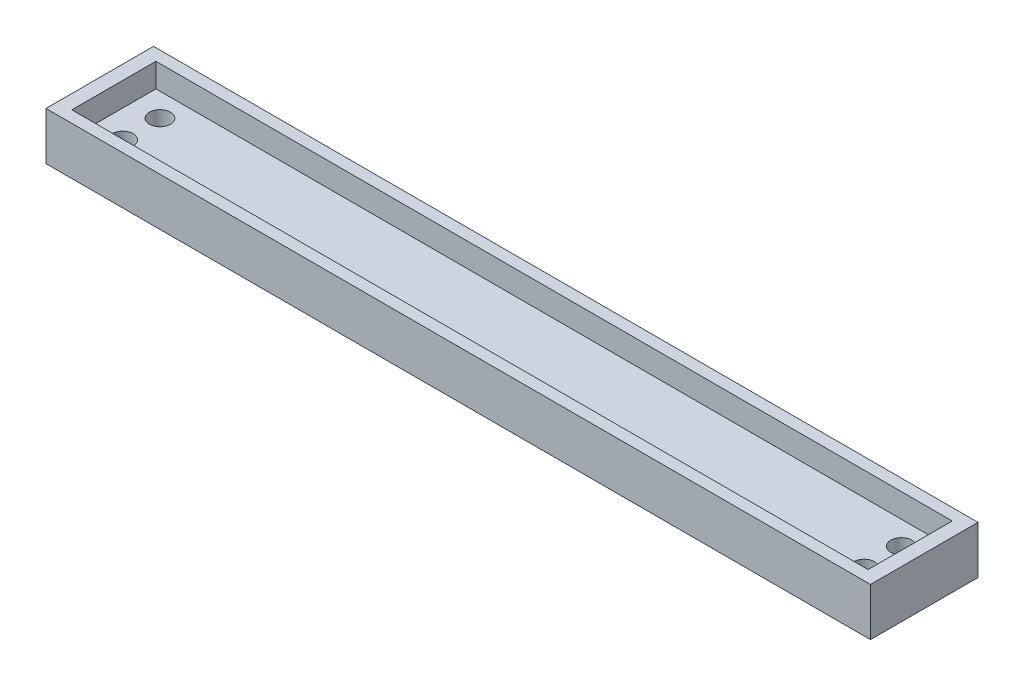
ISO-10303-21;
HEADER;
FILE_DESCRIPTION(('STEP AP214'),'2;1');
FILE_NAME('part.step','',(''),(''),'','','');
FILE_SCHEMA(('AUTOMOTIVE_DESIGN { 1 0 10303 214 1 1 1 1 }'));
ENDSEC;
DATA;
#1=APPLICATION_CONTEXT('core data for automotive mechanical design processes');
#2=APPLICATION_PROTOCOL_DEFINITION('international standard','automotive_design',2000,#1);
#3=PRODUCT_CONTEXT('',#1,'mechanical');
#4=PRODUCT('Part','Part','',(#3));
#5=PRODUCT_RELATED_PRODUCT_CATEGORY('part','',(#4));
#6=PRODUCT_DEFINITION_FORMATION('','',#4);
#7=PRODUCT_DEFINITION_CONTEXT('part definition',#1,'design');
#8=PRODUCT_DEFINITION('design','',#6,#7);
#9=PRODUCT_DEFINITION_SHAPE('','',#8);
#10=(LENGTH_UNIT() NAMED_UNIT(*) SI_UNIT(.MILLI.,.METRE.));
#11=(NAMED_UNIT(*) PLANE_ANGLE_UNIT() SI_UNIT($,.RADIAN.));
#12=(NAMED_UNIT(*) SI_UNIT($,.STERADIAN.) SOLID_ANGLE_UNIT());
#13=UNCERTAINTY_MEASURE_WITH_UNIT(LENGTH_MEASURE(1.E-05),#10,'distance_accuracy_value','');
#14=(GEOMETRIC_REPRESENTATION_CONTEXT(3) GLOBAL_UNCERTAINTY_ASSIGNED_CONTEXT((#13)) GLOBAL_UNIT_ASSIGNED_CONTEXT((#10,
#11,#12)) REPRESENTATION_CONTEXT('',''));
#15=CARTESIAN_POINT('',(0.,0.,0.));
#16=DIRECTION('',(0.,0.,1.));
#17=DIRECTION('',(1.,0.,0.));
#18=AXIS2_PLACEMENT_3D('',#15,#16,#17);
#19=CARTESIAN_POINT('',(0.,12.7,0.));
#20=DIRECTION('',(1.,0.,0.));
#21=DIRECTION('',(0.,0.,-1.));
#22=AXIS2_PLACEMENT_3D('',#19,#20,#21);
#23=PLANE('',#22);
#24=DIRECTION('',(0.,0.,1.));
#25=VECTOR('',#24,1.);
#26=CARTESIAN_POINT('',(0.,0.,0.));
#27=LINE('',#26,#25);
#28=CARTESIAN_POINT('',(0.,0.,-28.575));
#29=VERTEX_POINT('',#28);
#30=CARTESIAN_POINT('',(0.,0.,0.));
#31=VERTEX_POINT('',#30);
#32=EDGE_CURVE('E149',#29,#31,#27,.T.);
#33=ORIENTED_EDGE('',*,*,#32,.T.);
#34=DIRECTION('',(0.,-1.,0.));
#35=VECTOR('',#34,1.);
#36=CARTESIAN_POINT('',(0.,12.7,0.));
#37=LINE('',#36,#35);
#38=CARTESIAN_POINT('',(0.,12.7,0.));
#39=VERTEX_POINT('',#38);
#40=EDGE_CURVE('E11',#39,#31,#37,.T.);
#41=ORIENTED_EDGE('',*,*,#40,.F.);
#42=DIRECTION('',(0.,0.,1.));
#43=VECTOR('',#42,1.);
#44=CARTESIAN_POINT('',(0.,12.7,0.));
#45=LINE('',#44,#43);
#46=CARTESIAN_POINT('',(0.,12.7,-28.575));
#47=VERTEX_POINT('',#46);
#48=EDGE_CURVE('E153',#47,#39,#45,.T.);
#49=ORIENTED_EDGE('',*,*,#48,.F.);
#50=DIRECTION('',(0.,-1.,0.));
#51=VECTOR('',#50,1.);
#52=CARTESIAN_POINT('',(0.,12.7,-28.575));
#53=LINE('',#52,#51);
#54=EDGE_CURVE('E159',#47,#29,#53,.T.);
#55=ORIENTED_EDGE('',*,*,#54,.T.);
#56=EDGE_LOOP('',(#33,#41,#49,#55));
#57=FACE_BOUND('',#56,.T.);
#58=ADVANCED_FACE('F37',(#57),#23,.F.);
#59=CARTESIAN_POINT('',(0.,12.7,0.));
#60=DIRECTION('',(0.,0.,-1.));
#61=DIRECTION('',(-1.,0.,0.));
#62=AXIS2_PLACEMENT_3D('',#59,#60,#61);
#63=PLANE('',#62);
#64=DIRECTION('',(1.,0.,0.));
#65=VECTOR('',#64,1.);
#66=CARTESIAN_POINT('',(0.,0.,0.));
#67=LINE('',#66,#65);
#68=CARTESIAN_POINT('',(219.075,0.,0.));
#69=VERTEX_POINT('',#68);
#70=EDGE_CURVE('E162',#31,#69,#67,.T.);
#71=ORIENTED_EDGE('',*,*,#70,.T.);
#72=DIRECTION('',(0.,-1.,0.));
#73=VECTOR('',#72,1.);
#74=CARTESIAN_POINT('',(219.075,12.7,0.));
#75=LINE('',#74,#73);
#76=CARTESIAN_POINT('',(219.075,12.7,0.));
#77=VERTEX_POINT('',#76);
#78=EDGE_CURVE('E44',#77,#69,#75,.T.);
#79=ORIENTED_EDGE('',*,*,#78,.F.);
#80=DIRECTION('',(1.,0.,0.));
#81=VECTOR('',#80,1.);
#82=CARTESIAN_POINT('',(0.,12.7,0.));
#83=LINE('',#82,#81);
#84=EDGE_CURVE('E88',#39,#77,#83,.T.);
#85=ORIENTED_EDGE('',*,*,#84,.F.);
#86=ORIENTED_EDGE('',*,*,#40,.T.);
#87=EDGE_LOOP('',(#71,#79,#85,#86));
#88=FACE_BOUND('',#87,.T.);
#89=ADVANCED_FACE('F191',(#88),#63,.F.);
#90=CARTESIAN_POINT('',(219.075,12.7,0.));
#91=DIRECTION('',(-1.,0.,0.));
#92=DIRECTION('',(0.,0.,1.));
#93=AXIS2_PLACEMENT_3D('',#90,#91,#92);
#94=PLANE('',#93);
#95=DIRECTION('',(0.,0.,-1.));
#96=VECTOR('',#95,1.);
#97=CARTESIAN_POINT('',(219.075,0.,0.));
#98=LINE('',#97,#96);
#99=CARTESIAN_POINT('',(219.075,0.,-28.575));
#100=VERTEX_POINT('',#99);
#101=EDGE_CURVE('E164',#69,#100,#98,.T.);
#102=ORIENTED_EDGE('',*,*,#101,.T.);
#103=DIRECTION('',(0.,-1.,0.));
#104=VECTOR('',#103,1.);
#105=CARTESIAN_POINT('',(219.075,12.7,-28.575));
#106=LINE('',#105,#104);
#107=CARTESIAN_POINT('',(219.075,12.7,-28.575));
#108=VERTEX_POINT('',#107);
#109=EDGE_CURVE('E168',#108,#100,#106,.T.);
#110=ORIENTED_EDGE('',*,*,#109,.F.);
#111=DIRECTION('',(0.,0.,-1.));
#112=VECTOR('',#111,1.);
#113=CARTESIAN_POINT('',(219.075,12.7,0.));
#114=LINE('',#113,#112);
#115=EDGE_CURVE('E156',#77,#108,#114,.T.);
#116=ORIENTED_EDGE('',*,*,#115,.F.);
#117=ORIENTED_EDGE('',*,*,#78,.T.);
#118=EDGE_LOOP('',(#102,#110,#116,#117));
#119=FACE_BOUND('',#118,.T.);
#120=ADVANCED_FACE('F173',(#119),#94,.F.);
#121=CARTESIAN_POINT('',(0.,12.7,-28.575));
#122=DIRECTION('',(0.,0.,1.));
#123=DIRECTION('',(1.,0.,0.));
#124=AXIS2_PLACEMENT_3D('',#121,#122,#123);
#125=PLANE('',#124);
#126=DIRECTION('',(-1.,0.,0.));
#127=VECTOR('',#126,1.);
#128=CARTESIAN_POINT('',(0.,0.,-28.575));
#129=LINE('',#128,#127);
#130=EDGE_CURVE('E81',#100,#29,#129,.T.);
#131=ORIENTED_EDGE('',*,*,#130,.T.);
#132=ORIENTED_EDGE('',*,*,#54,.F.);
#133=DIRECTION('',(-1.,0.,0.));
#134=VECTOR('',#133,1.);
#135=CARTESIAN_POINT('',(0.,12.7,-28.575));
#136=LINE('',#135,#134);
#137=EDGE_CURVE('E60',#108,#47,#136,.T.);
#138=ORIENTED_EDGE('',*,*,#137,.F.);
#139=ORIENTED_EDGE('',*,*,#109,.T.);
#140=EDGE_LOOP('',(#131,#132,#138,#139));
#141=FACE_BOUND('',#140,.T.);
#142=ADVANCED_FACE('F181',(#141),#125,.F.);
#143=CARTESIAN_POINT('',(0.,12.7,0.));
#144=DIRECTION('',(0.,-1.,0.));
#145=DIRECTION('',(0.,0.,-1.));
#146=AXIS2_PLACEMENT_3D('',#143,#144,#145);
#147=PLANE('',#146);
#148=DIRECTION('',(1.,0.,0.));
#149=VECTOR('',#148,1.);
#150=CARTESIAN_POINT('',(3.74650000000001,12.7,-3.11149999999999));
#151=LINE('',#150,#149);
#152=CARTESIAN_POINT('',(3.74650000000001,12.7,-3.11149999999999));
#153=VERTEX_POINT('',#152);
#154=CARTESIAN_POINT('',(215.3285,12.7,-3.11150000000001));
#155=VERTEX_POINT('',#154);
#156=EDGE_CURVE('E142',#153,#155,#151,.T.);
#157=ORIENTED_EDGE('',*,*,#156,.F.);
#158=DIRECTION('',(0.,0.,1.));
#159=VECTOR('',#158,1.);
#160=CARTESIAN_POINT('',(3.74649999999999,12.7,-25.4635));
#161=LINE('',#160,#159);
#162=CARTESIAN_POINT('',(3.74649999999999,12.7,-25.4635));
#163=VERTEX_POINT('',#162);
#164=EDGE_CURVE('E51',#163,#153,#161,.T.);
#165=ORIENTED_EDGE('',*,*,#164,.F.);
#166=DIRECTION('',(-1.,0.,0.));
#167=VECTOR('',#166,1.);
#168=CARTESIAN_POINT('',(3.74649999999999,12.7,-25.4635));
#169=LINE('',#168,#167);
#170=CARTESIAN_POINT('',(215.3285,12.7,-25.4635));
#171=VERTEX_POINT('',#170);
#172=EDGE_CURVE('E130',#171,#163,#169,.T.);
#173=ORIENTED_EDGE('',*,*,#172,.F.);
#174=DIRECTION('',(0.,0.,-1.));
#175=VECTOR('',#174,1.);
#176=CARTESIAN_POINT('',(215.3285,12.7,-25.4635));
#177=LINE('',#176,#175);
#178=EDGE_CURVE('E133',#155,#171,#177,.T.);
#179=ORIENTED_EDGE('',*,*,#178,.F.);
#180=EDGE_LOOP('',(#157,#165,#173,#179));
#181=FACE_BOUND('',#180,.T.);
#182=ORIENTED_EDGE('',*,*,#48,.T.);
#183=ORIENTED_EDGE('',*,*,#84,.T.);
#184=ORIENTED_EDGE('',*,*,#115,.T.);
#185=ORIENTED_EDGE('',*,*,#137,.T.);
#186=EDGE_LOOP('',(#182,#183,#184,#185));
#187=FACE_BOUND('',#186,.T.);
#188=ADVANCED_FACE('F183',(#181,#187),#147,.F.);
#189=CARTESIAN_POINT('',(0.,0.,0.));
#190=DIRECTION('',(0.,-1.,0.));
#191=DIRECTION('',(0.,0.,-1.));
#192=AXIS2_PLACEMENT_3D('',#189,#190,#191);
#193=PLANE('',#192);
#194=CARTESIAN_POINT('',(208.0387,0.,-19.2405));
#195=DIRECTION('',(0.,1.,0.));
#196=DIRECTION('',(0.,0.,-1.));
#197=AXIS2_PLACEMENT_3D('',#194,#195,#196);
#198=CIRCLE('',#197,2.79399999999998);
#199=CARTESIAN_POINT('',(208.0387,0.,-22.0345));
#200=VERTEX_POINT('',#199);
#201=EDGE_CURVE('E314',#200,#200,#198,.T.);
#202=ORIENTED_EDGE('',*,*,#201,.T.);
#203=EDGE_LOOP('',(#202));
#204=FACE_BOUND('',#203,.T.);
#205=CARTESIAN_POINT('',(208.0387,0.,-9.33450000000004));
#206=DIRECTION('',(0.,1.,0.));
#207=DIRECTION('',(0.,0.,1.));
#208=AXIS2_PLACEMENT_3D('',#205,#206,#207);
#209=CIRCLE('',#208,2.79400000000001);
#210=CARTESIAN_POINT('',(208.0387,0.,-6.54050000000003));
#211=VERTEX_POINT('',#210);
#212=EDGE_CURVE('E335',#211,#211,#209,.T.);
#213=ORIENTED_EDGE('',*,*,#212,.T.);
#214=EDGE_LOOP('',(#213));
#215=FACE_BOUND('',#214,.T.);
#216=CARTESIAN_POINT('',(11.0363,0.,-9.33450000000002));
#217=DIRECTION('',(0.,1.,0.));
#218=DIRECTION('',(0.,0.,-1.));
#219=AXIS2_PLACEMENT_3D('',#216,#217,#218);
#220=CIRCLE('',#219,2.794);
#221=CARTESIAN_POINT('',(11.0363,0.,-12.1285));
#222=VERTEX_POINT('',#221);
#223=EDGE_CURVE('E326',#222,#222,#220,.T.);
#224=ORIENTED_EDGE('',*,*,#223,.T.);
#225=EDGE_LOOP('',(#224));
#226=FACE_BOUND('',#225,.T.);
#227=CARTESIAN_POINT('',(11.0363,0.,-19.2405));
#228=DIRECTION('',(0.,1.,0.));
#229=DIRECTION('',(0.,0.,1.));
#230=AXIS2_PLACEMENT_3D('',#227,#228,#229);
#231=CIRCLE('',#230,2.794);
#232=CARTESIAN_POINT('',(11.0363,0.,-16.4465));
#233=VERTEX_POINT('',#232);
#234=EDGE_CURVE('E143',#233,#233,#231,.T.);
#235=ORIENTED_EDGE('',*,*,#234,.T.);
#236=EDGE_LOOP('',(#235));
#237=FACE_BOUND('',#236,.T.);
#238=ORIENTED_EDGE('',*,*,#32,.F.);
#239=ORIENTED_EDGE('',*,*,#130,.F.);
#240=ORIENTED_EDGE('',*,*,#101,.F.);
#241=ORIENTED_EDGE('',*,*,#70,.F.);
#242=EDGE_LOOP('',(#238,#239,#240,#241));
#243=FACE_BOUND('',#242,.T.);
#244=ADVANCED_FACE('F177',(#204,#215,#226,#237,#243),#193,.T.);
#245=CARTESIAN_POINT('',(3.74649999999999,6.35,-25.4635));
#246=DIRECTION('',(-1.,0.,0.));
#247=DIRECTION('',(0.,0.,1.));
#248=AXIS2_PLACEMENT_3D('',#245,#246,#247);
#249=PLANE('',#248);
#250=ORIENTED_EDGE('',*,*,#164,.T.);
#251=DIRECTION('',(0.,1.,0.));
#252=VECTOR('',#251,1.);
#253=CARTESIAN_POINT('',(3.74650000000001,6.35,-3.11149999999999));
#254=LINE('',#253,#252);
#255=CARTESIAN_POINT('',(3.74650000000001,6.35,-3.11149999999999));
#256=VERTEX_POINT('',#255);
#257=EDGE_CURVE('E108',#256,#153,#254,.T.);
#258=ORIENTED_EDGE('',*,*,#257,.F.);
#259=DIRECTION('',(0.,0.,1.));
#260=VECTOR('',#259,1.);
#261=CARTESIAN_POINT('',(3.74649999999999,6.35,-25.4635));
#262=LINE('',#261,#260);
#263=CARTESIAN_POINT('',(3.74649999999999,6.35,-25.4635));
#264=VERTEX_POINT('',#263);
#265=EDGE_CURVE('E112',#264,#256,#262,.T.);
#266=ORIENTED_EDGE('',*,*,#265,.F.);
#267=DIRECTION('',(0.,1.,0.));
#268=VECTOR('',#267,1.);
#269=CARTESIAN_POINT('',(3.74649999999999,6.35,-25.4635));
#270=LINE('',#269,#268);
#271=EDGE_CURVE('E147',#264,#163,#270,.T.);
#272=ORIENTED_EDGE('',*,*,#271,.T.);
#273=EDGE_LOOP('',(#250,#258,#266,#272));
#274=FACE_BOUND('',#273,.T.);
#275=ADVANCED_FACE('F110',(#274),#249,.F.);
#276=CARTESIAN_POINT('',(3.74649999999999,6.35,-25.4635));
#277=DIRECTION('',(0.,0.,-1.));
#278=DIRECTION('',(-1.,0.,0.));
#279=AXIS2_PLACEMENT_3D('',#276,#277,#278);
#280=PLANE('',#279);
#281=ORIENTED_EDGE('',*,*,#172,.T.);
#282=ORIENTED_EDGE('',*,*,#271,.F.);
#283=DIRECTION('',(-1.,0.,0.));
#284=VECTOR('',#283,1.);
#285=CARTESIAN_POINT('',(3.74649999999999,6.35,-25.4635));
#286=LINE('',#285,#284);
#287=CARTESIAN_POINT('',(215.3285,6.35,-25.4635));
#288=VERTEX_POINT('',#287);
#289=EDGE_CURVE('E118',#288,#264,#286,.T.);
#290=ORIENTED_EDGE('',*,*,#289,.F.);
#291=DIRECTION('',(0.,1.,0.));
#292=VECTOR('',#291,1.);
#293=CARTESIAN_POINT('',(215.3285,6.35,-25.4635));
#294=LINE('',#293,#292);
#295=EDGE_CURVE('E150',#288,#171,#294,.T.);
#296=ORIENTED_EDGE('',*,*,#295,.T.);
#297=EDGE_LOOP('',(#281,#282,#290,#296));
#298=FACE_BOUND('',#297,.T.);
#299=ADVANCED_FACE('F225',(#298),#280,.F.);
#300=CARTESIAN_POINT('',(215.3285,6.35,-25.4635));
#301=DIRECTION('',(1.,0.,0.));
#302=DIRECTION('',(0.,0.,-1.));
#303=AXIS2_PLACEMENT_3D('',#300,#301,#302);
#304=PLANE('',#303);
#305=ORIENTED_EDGE('',*,*,#178,.T.);
#306=ORIENTED_EDGE('',*,*,#295,.F.);
#307=DIRECTION('',(0.,0.,-1.));
#308=VECTOR('',#307,1.);
#309=CARTESIAN_POINT('',(215.3285,6.35,-25.4635));
#310=LINE('',#309,#308);
#311=CARTESIAN_POINT('',(215.3285,6.35,-3.11150000000001));
#312=VERTEX_POINT('',#311);
#313=EDGE_CURVE('E126',#312,#288,#310,.T.);
#314=ORIENTED_EDGE('',*,*,#313,.F.);
#315=DIRECTION('',(0.,1.,0.));
#316=VECTOR('',#315,1.);
#317=CARTESIAN_POINT('',(215.3285,6.35,-3.11150000000001));
#318=LINE('',#317,#316);
#319=EDGE_CURVE('E117',#312,#155,#318,.T.);
#320=ORIENTED_EDGE('',*,*,#319,.T.);
#321=EDGE_LOOP('',(#305,#306,#314,#320));
#322=FACE_BOUND('',#321,.T.);
#323=ADVANCED_FACE('F234',(#322),#304,.F.);
#324=CARTESIAN_POINT('',(3.74650000000001,6.35,-3.11149999999999));
#325=DIRECTION('',(0.,0.,1.));
#326=DIRECTION('',(1.,0.,0.));
#327=AXIS2_PLACEMENT_3D('',#324,#325,#326);
#328=PLANE('',#327);
#329=ORIENTED_EDGE('',*,*,#156,.T.);
#330=ORIENTED_EDGE('',*,*,#319,.F.);
#331=DIRECTION('',(1.,0.,0.));
#332=VECTOR('',#331,1.);
#333=CARTESIAN_POINT('',(3.74650000000001,6.35,-3.11149999999999));
#334=LINE('',#333,#332);
#335=EDGE_CURVE('E121',#256,#312,#334,.T.);
#336=ORIENTED_EDGE('',*,*,#335,.F.);
#337=ORIENTED_EDGE('',*,*,#257,.T.);
#338=EDGE_LOOP('',(#329,#330,#336,#337));
#339=FACE_BOUND('',#338,.T.);
#340=ADVANCED_FACE('F122',(#339),#328,.F.);
#341=CARTESIAN_POINT('',(0.,6.35,0.));
#342=DIRECTION('',(0.,1.,0.));
#343=DIRECTION('',(0.,0.,1.));
#344=AXIS2_PLACEMENT_3D('',#341,#342,#343);
#345=PLANE('',#344);
#346=CARTESIAN_POINT('',(208.0387,6.35,-19.2405));
#347=DIRECTION('',(0.,1.,0.));
#348=DIRECTION('',(0.,0.,-1.));
#349=AXIS2_PLACEMENT_3D('',#346,#347,#348);
#350=CIRCLE('',#349,2.79399999999998);
#351=CARTESIAN_POINT('',(208.0387,6.35,-22.0345));
#352=VERTEX_POINT('',#351);
#353=EDGE_CURVE('E317',#352,#352,#350,.T.);
#354=ORIENTED_EDGE('',*,*,#353,.F.);
#355=EDGE_LOOP('',(#354));
#356=FACE_BOUND('',#355,.T.);
#357=CARTESIAN_POINT('',(208.0387,6.35,-9.33450000000004));
#358=DIRECTION('',(0.,1.,0.));
#359=DIRECTION('',(0.,0.,1.));
#360=AXIS2_PLACEMENT_3D('',#357,#358,#359);
#361=CIRCLE('',#360,2.79400000000001);
#362=CARTESIAN_POINT('',(208.0387,6.35,-6.54050000000003));
#363=VERTEX_POINT('',#362);
#364=EDGE_CURVE('E319',#363,#363,#361,.T.);
#365=ORIENTED_EDGE('',*,*,#364,.F.);
#366=EDGE_LOOP('',(#365));
#367=FACE_BOUND('',#366,.T.);
#368=CARTESIAN_POINT('',(11.0363,6.35,-9.33450000000002));
#369=DIRECTION('',(0.,1.,0.));
#370=DIRECTION('',(0.,0.,-1.));
#371=AXIS2_PLACEMENT_3D('',#368,#369,#370);
#372=CIRCLE('',#371,2.794);
#373=CARTESIAN_POINT('',(11.0363,6.35,-12.1285));
#374=VERTEX_POINT('',#373);
#375=EDGE_CURVE('E330',#374,#374,#372,.T.);
#376=ORIENTED_EDGE('',*,*,#375,.F.);
#377=EDGE_LOOP('',(#376));
#378=FACE_BOUND('',#377,.T.);
#379=CARTESIAN_POINT('',(11.0363,6.35,-19.2405));
#380=DIRECTION('',(0.,1.,0.));
#381=DIRECTION('',(0.,0.,1.));
#382=AXIS2_PLACEMENT_3D('',#379,#380,#381);
#383=CIRCLE('',#382,2.794);
#384=CARTESIAN_POINT('',(11.0363,6.35,-16.4465));
#385=VERTEX_POINT('',#384);
#386=EDGE_CURVE('E136',#385,#385,#383,.T.);
#387=ORIENTED_EDGE('',*,*,#386,.F.);
#388=EDGE_LOOP('',(#387));
#389=FACE_BOUND('',#388,.T.);
#390=ORIENTED_EDGE('',*,*,#265,.T.);
#391=ORIENTED_EDGE('',*,*,#335,.T.);
#392=ORIENTED_EDGE('',*,*,#313,.T.);
#393=ORIENTED_EDGE('',*,*,#289,.T.);
#394=EDGE_LOOP('',(#390,#391,#392,#393));
#395=FACE_BOUND('',#394,.T.);
#396=ADVANCED_FACE('F128',(#356,#367,#378,#389,#395),#345,.T.);
#397=CARTESIAN_POINT('',(11.0363,0.,-19.2405));
#398=DIRECTION('',(0.,1.,0.));
#399=DIRECTION('',(0.,0.,1.));
#400=AXIS2_PLACEMENT_3D('',#397,#398,#399);
#401=CYLINDRICAL_SURFACE('',#400,2.794);
#402=ORIENTED_EDGE('',*,*,#234,.F.);
#403=EDGE_LOOP('',(#402));
#404=FACE_BOUND('',#403,.T.);
#405=ORIENTED_EDGE('',*,*,#386,.T.);
#406=EDGE_LOOP('',(#405));
#407=FACE_BOUND('',#406,.T.);
#408=ADVANCED_FACE('F267',(#404,#407),#401,.F.);
#409=CARTESIAN_POINT('',(11.0363,0.,-9.33450000000002));
#410=DIRECTION('',(0.,1.,0.));
#411=DIRECTION('',(0.,0.,1.));
#412=AXIS2_PLACEMENT_3D('',#409,#410,#411);
#413=CYLINDRICAL_SURFACE('',#412,2.794);
#414=ORIENTED_EDGE('',*,*,#223,.F.);
#415=EDGE_LOOP('',(#414));
#416=FACE_BOUND('',#415,.T.);
#417=ORIENTED_EDGE('',*,*,#375,.T.);
#418=EDGE_LOOP('',(#417));
#419=FACE_BOUND('',#418,.T.);
#420=ADVANCED_FACE('F277',(#416,#419),#413,.F.);
#421=CARTESIAN_POINT('',(208.0387,0.,-9.33450000000004));
#422=DIRECTION('',(0.,1.,0.));
#423=DIRECTION('',(0.,0.,1.));
#424=AXIS2_PLACEMENT_3D('',#421,#422,#423);
#425=CYLINDRICAL_SURFACE('',#424,2.79400000000001);
#426=ORIENTED_EDGE('',*,*,#212,.F.);
#427=EDGE_LOOP('',(#426));
#428=FACE_BOUND('',#427,.T.);
#429=ORIENTED_EDGE('',*,*,#364,.T.);
#430=EDGE_LOOP('',(#429));
#431=FACE_BOUND('',#430,.T.);
#432=ADVANCED_FACE('F287',(#428,#431),#425,.F.);
#433=CARTESIAN_POINT('',(208.0387,0.,-19.2405));
#434=DIRECTION('',(0.,1.,0.));
#435=DIRECTION('',(0.,0.,1.));
#436=AXIS2_PLACEMENT_3D('',#433,#434,#435);
#437=CYLINDRICAL_SURFACE('',#436,2.79399999999998);
#438=ORIENTED_EDGE('',*,*,#201,.F.);
#439=EDGE_LOOP('',(#438));
#440=FACE_BOUND('',#439,.T.);
#441=ORIENTED_EDGE('',*,*,#353,.T.);
#442=EDGE_LOOP('',(#441));
#443=FACE_BOUND('',#442,.T.);
#444=ADVANCED_FACE('F297',(#440,#443),#437,.F.);
#445=CLOSED_SHELL('',(#58,#89,#120,#142,#188,#244,#275,#299,#323,#340,#396,#408,#420,#432,#444));
#446=MANIFOLD_SOLID_BREP('B2',#445);
#447=ADVANCED_BREP_SHAPE_REPRESENTATION('',(#18,#446),#14);
#448=SHAPE_DEFINITION_REPRESENTATION(#9,#447);
ENDSEC;
END-ISO-10303-21;
